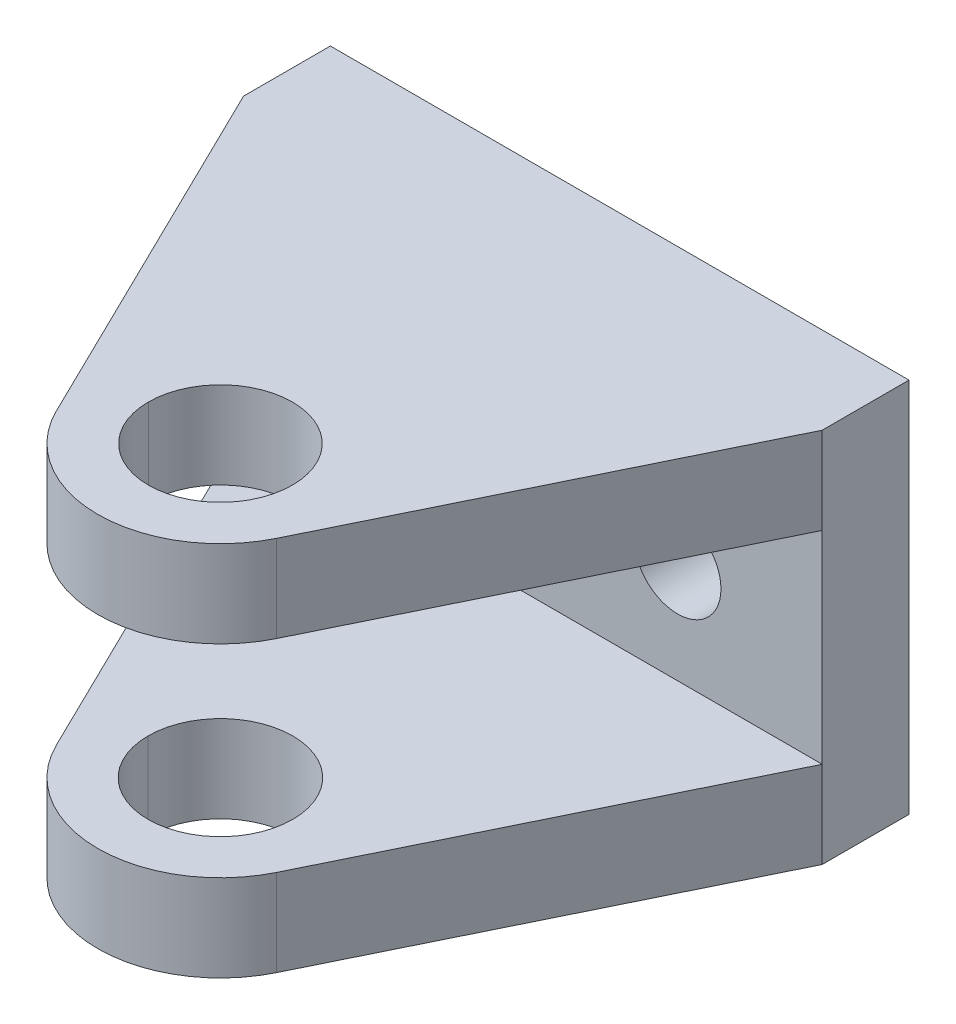
ISO-10303-21;
HEADER;
FILE_DESCRIPTION(('STEP AP214'),'2;1');
FILE_NAME('part.step','',(''),(''),'','','');
FILE_SCHEMA(('AUTOMOTIVE_DESIGN { 1 0 10303 214 1 1 1 1 }'));
ENDSEC;
DATA;
#1=APPLICATION_CONTEXT('core data for automotive mechanical design processes');
#2=APPLICATION_PROTOCOL_DEFINITION('international standard','automotive_design',2000,#1);
#3=PRODUCT_CONTEXT('',#1,'mechanical');
#4=PRODUCT('Part','Part','',(#3));
#5=PRODUCT_RELATED_PRODUCT_CATEGORY('part','',(#4));
#6=PRODUCT_DEFINITION_FORMATION('','',#4);
#7=PRODUCT_DEFINITION_CONTEXT('part definition',#1,'design');
#8=PRODUCT_DEFINITION('design','',#6,#7);
#9=PRODUCT_DEFINITION_SHAPE('','',#8);
#10=(LENGTH_UNIT() NAMED_UNIT(*) SI_UNIT(.MILLI.,.METRE.));
#11=(NAMED_UNIT(*) PLANE_ANGLE_UNIT() SI_UNIT($,.RADIAN.));
#12=(NAMED_UNIT(*) SI_UNIT($,.STERADIAN.) SOLID_ANGLE_UNIT());
#13=UNCERTAINTY_MEASURE_WITH_UNIT(LENGTH_MEASURE(1.E-05),#10,'distance_accuracy_value','');
#14=(GEOMETRIC_REPRESENTATION_CONTEXT(3) GLOBAL_UNCERTAINTY_ASSIGNED_CONTEXT((#13)) GLOBAL_UNIT_ASSIGNED_CONTEXT((#10,
#11,#12)) REPRESENTATION_CONTEXT('',''));
#15=CARTESIAN_POINT('',(0.,0.,0.));
#16=DIRECTION('',(0.,0.,1.));
#17=DIRECTION('',(1.,0.,0.));
#18=AXIS2_PLACEMENT_3D('',#15,#16,#17);
#19=CARTESIAN_POINT('',(5.,3.5,13.8));
#20=DIRECTION('',(0.,1.,0.));
#21=DIRECTION('',(-1.,0.,0.));
#22=AXIS2_PLACEMENT_3D('',#19,#20,#21);
#23=CYLINDRICAL_SURFACE('',#22,2.48870243190225);
#24=CARTESIAN_POINT('',(5.,3.5,13.8));
#25=DIRECTION('',(0.,1.,0.));
#26=DIRECTION('',(-1.,0.,0.));
#27=AXIS2_PLACEMENT_3D('',#24,#25,#26);
#28=CIRCLE('',#27,2.48870243190225);
#29=CARTESIAN_POINT('',(7.48870243190224,3.5,13.8));
#30=VERTEX_POINT('',#29);
#31=CARTESIAN_POINT('',(2.51129756809775,3.5,13.8));
#32=VERTEX_POINT('',#31);
#33=EDGE_CURVE('E41',#30,#32,#28,.T.);
#34=ORIENTED_EDGE('',*,*,#33,.F.);
#35=DIRECTION('',(0.,1.,0.));
#36=VECTOR('',#35,1.);
#37=CARTESIAN_POINT('',(7.48870243190224,3.5,13.8));
#38=LINE('',#37,#36);
#39=CARTESIAN_POINT('',(7.48870243190224,6.5,13.8));
#40=VERTEX_POINT('',#39);
#41=EDGE_CURVE('E11',#30,#40,#38,.T.);
#42=ORIENTED_EDGE('',*,*,#41,.T.);
#43=CARTESIAN_POINT('',(5.,6.5,13.8));
#44=DIRECTION('',(0.,1.,0.));
#45=DIRECTION('',(-1.,0.,0.));
#46=AXIS2_PLACEMENT_3D('',#43,#44,#45);
#47=CIRCLE('',#46,2.48870243190225);
#48=CARTESIAN_POINT('',(2.51129756809775,6.5,13.8));
#49=VERTEX_POINT('',#48);
#50=EDGE_CURVE('E28',#40,#49,#47,.T.);
#51=ORIENTED_EDGE('',*,*,#50,.T.);
#52=DIRECTION('',(0.,1.,0.));
#53=VECTOR('',#52,1.);
#54=CARTESIAN_POINT('',(2.51129756809775,3.5,13.8));
#55=LINE('',#54,#53);
#56=EDGE_CURVE('E170',#32,#49,#55,.T.);
#57=ORIENTED_EDGE('',*,*,#56,.F.);
#58=EDGE_LOOP('',(#34,#42,#51,#57));
#59=FACE_BOUND('',#58,.T.);
#60=ADVANCED_FACE('F17',(#59),#23,.F.);
#61=CARTESIAN_POINT('',(5.,-3.5,13.8));
#62=DIRECTION('',(0.,-1.,0.));
#63=DIRECTION('',(1.,0.,0.));
#64=AXIS2_PLACEMENT_3D('',#61,#62,#63);
#65=CYLINDRICAL_SURFACE('',#64,2.5);
#66=CARTESIAN_POINT('',(5.,-3.5,13.8));
#67=DIRECTION('',(0.,-1.,0.));
#68=DIRECTION('',(1.,0.,0.));
#69=AXIS2_PLACEMENT_3D('',#66,#67,#68);
#70=CIRCLE('',#69,2.5);
#71=CARTESIAN_POINT('',(2.5,-3.5,13.8));
#72=VERTEX_POINT('',#71);
#73=CARTESIAN_POINT('',(7.5,-3.5,13.8));
#74=VERTEX_POINT('',#73);
#75=EDGE_CURVE('E264',#72,#74,#70,.T.);
#76=ORIENTED_EDGE('',*,*,#75,.F.);
#77=DIRECTION('',(0.,-1.,0.));
#78=VECTOR('',#77,1.);
#79=CARTESIAN_POINT('',(2.5,-3.5,13.8));
#80=LINE('',#79,#78);
#81=CARTESIAN_POINT('',(2.5,-6.5,13.8));
#82=VERTEX_POINT('',#81);
#83=EDGE_CURVE('E207',#72,#82,#80,.T.);
#84=ORIENTED_EDGE('',*,*,#83,.T.);
#85=CARTESIAN_POINT('',(5.,-6.5,13.8));
#86=DIRECTION('',(0.,-1.,0.));
#87=DIRECTION('',(1.,0.,0.));
#88=AXIS2_PLACEMENT_3D('',#85,#86,#87);
#89=CIRCLE('',#88,2.5);
#90=CARTESIAN_POINT('',(7.5,-6.5,13.8));
#91=VERTEX_POINT('',#90);
#92=EDGE_CURVE('E21',#82,#91,#89,.T.);
#93=ORIENTED_EDGE('',*,*,#92,.T.);
#94=DIRECTION('',(0.,-1.,0.));
#95=VECTOR('',#94,1.);
#96=CARTESIAN_POINT('',(7.5,-3.5,13.8));
#97=LINE('',#96,#95);
#98=EDGE_CURVE('E217',#74,#91,#97,.T.);
#99=ORIENTED_EDGE('',*,*,#98,.F.);
#100=EDGE_LOOP('',(#76,#84,#93,#99));
#101=FACE_BOUND('',#100,.T.);
#102=ADVANCED_FACE('F448',(#101),#65,.F.);
#103=CARTESIAN_POINT('',(10.,0.,3.));
#104=DIRECTION('',(0.,0.,-1.));
#105=DIRECTION('',(-1.,0.,0.));
#106=AXIS2_PLACEMENT_3D('',#103,#104,#105);
#107=CYLINDRICAL_SURFACE('',#106,1.5);
#108=CARTESIAN_POINT('',(10.,0.,3.));
#109=DIRECTION('',(0.,0.,1.));
#110=DIRECTION('',(1.,0.,0.));
#111=AXIS2_PLACEMENT_3D('',#108,#109,#110);
#112=CIRCLE('',#111,1.5);
#113=CARTESIAN_POINT('',(8.5,0.,3.));
#114=VERTEX_POINT('',#113);
#115=CARTESIAN_POINT('',(11.5,0.,3.));
#116=VERTEX_POINT('',#115);
#117=EDGE_CURVE('E184',#114,#116,#112,.T.);
#118=ORIENTED_EDGE('',*,*,#117,.T.);
#119=DIRECTION('',(0.,0.,-1.));
#120=VECTOR('',#119,1.);
#121=CARTESIAN_POINT('',(11.5,0.,3.));
#122=LINE('',#121,#120);
#123=CARTESIAN_POINT('',(11.5,0.,0.));
#124=VERTEX_POINT('',#123);
#125=EDGE_CURVE('E180',#116,#124,#122,.T.);
#126=ORIENTED_EDGE('',*,*,#125,.T.);
#127=CARTESIAN_POINT('',(10.,0.,0.));
#128=DIRECTION('',(0.,0.,1.));
#129=DIRECTION('',(1.,0.,0.));
#130=AXIS2_PLACEMENT_3D('',#127,#128,#129);
#131=CIRCLE('',#130,1.5);
#132=CARTESIAN_POINT('',(8.5,0.,0.));
#133=VERTEX_POINT('',#132);
#134=EDGE_CURVE('E269',#133,#124,#131,.T.);
#135=ORIENTED_EDGE('',*,*,#134,.F.);
#136=DIRECTION('',(0.,0.,-1.));
#137=VECTOR('',#136,1.);
#138=CARTESIAN_POINT('',(8.5,0.,3.));
#139=LINE('',#138,#137);
#140=EDGE_CURVE('E227',#114,#133,#139,.T.);
#141=ORIENTED_EDGE('',*,*,#140,.F.);
#142=EDGE_LOOP('',(#118,#126,#135,#141));
#143=FACE_BOUND('',#142,.T.);
#144=ADVANCED_FACE('F434',(#143),#107,.F.);
#145=CARTESIAN_POINT('',(0.,0.,3.));
#146=DIRECTION('',(0.,0.,-1.));
#147=DIRECTION('',(-1.,0.,0.));
#148=AXIS2_PLACEMENT_3D('',#145,#146,#147);
#149=CYLINDRICAL_SURFACE('',#148,1.5);
#150=CARTESIAN_POINT('',(0.,0.,3.));
#151=DIRECTION('',(0.,0.,1.));
#152=DIRECTION('',(1.,0.,0.));
#153=AXIS2_PLACEMENT_3D('',#150,#151,#152);
#154=CIRCLE('',#153,1.5);
#155=CARTESIAN_POINT('',(-1.5,0.,3.));
#156=VERTEX_POINT('',#155);
#157=CARTESIAN_POINT('',(1.5,0.,3.));
#158=VERTEX_POINT('',#157);
#159=EDGE_CURVE('E185',#156,#158,#154,.T.);
#160=ORIENTED_EDGE('',*,*,#159,.T.);
#161=DIRECTION('',(0.,0.,-1.));
#162=VECTOR('',#161,1.);
#163=CARTESIAN_POINT('',(1.5,0.,3.));
#164=LINE('',#163,#162);
#165=CARTESIAN_POINT('',(1.5,0.,0.));
#166=VERTEX_POINT('',#165);
#167=EDGE_CURVE('E166',#158,#166,#164,.T.);
#168=ORIENTED_EDGE('',*,*,#167,.T.);
#169=CARTESIAN_POINT('',(0.,0.,0.));
#170=DIRECTION('',(0.,0.,1.));
#171=DIRECTION('',(1.,0.,0.));
#172=AXIS2_PLACEMENT_3D('',#169,#170,#171);
#173=CIRCLE('',#172,1.5);
#174=CARTESIAN_POINT('',(-1.5,0.,0.));
#175=VERTEX_POINT('',#174);
#176=EDGE_CURVE('E199',#175,#166,#173,.T.);
#177=ORIENTED_EDGE('',*,*,#176,.F.);
#178=DIRECTION('',(0.,0.,-1.));
#179=VECTOR('',#178,1.);
#180=CARTESIAN_POINT('',(-1.5,0.,3.));
#181=LINE('',#180,#179);
#182=EDGE_CURVE('E226',#156,#175,#181,.T.);
#183=ORIENTED_EDGE('',*,*,#182,.F.);
#184=EDGE_LOOP('',(#160,#168,#177,#183));
#185=FACE_BOUND('',#184,.T.);
#186=ADVANCED_FACE('F436',(#185),#149,.F.);
#187=CARTESIAN_POINT('',(0.,0.,3.));
#188=DIRECTION('',(0.,0.,1.));
#189=DIRECTION('',(1.,0.,0.));
#190=AXIS2_PLACEMENT_3D('',#187,#188,#189);
#191=PLANE('',#190);
#192=DIRECTION('',(0.,1.,0.));
#193=VECTOR('',#192,1.);
#194=CARTESIAN_POINT('',(15.,-6.5,3.));
#195=LINE('',#194,#193);
#196=CARTESIAN_POINT('',(15.,-3.5,3.));
#197=VERTEX_POINT('',#196);
#198=CARTESIAN_POINT('',(15.,3.5,3.));
#199=VERTEX_POINT('',#198);
#200=EDGE_CURVE('E162',#197,#199,#195,.T.);
#201=ORIENTED_EDGE('',*,*,#200,.T.);
#202=DIRECTION('',(-1.,0.,0.));
#203=VECTOR('',#202,1.);
#204=CARTESIAN_POINT('',(-5.,3.5,3.));
#205=LINE('',#204,#203);
#206=CARTESIAN_POINT('',(-5.,3.5,3.));
#207=VERTEX_POINT('',#206);
#208=EDGE_CURVE('E167',#199,#207,#205,.T.);
#209=ORIENTED_EDGE('',*,*,#208,.T.);
#210=DIRECTION('',(0.,-1.,0.));
#211=VECTOR('',#210,1.);
#212=CARTESIAN_POINT('',(-5.,6.5,3.));
#213=LINE('',#212,#211);
#214=CARTESIAN_POINT('',(-5.,-3.5,3.));
#215=VERTEX_POINT('',#214);
#216=EDGE_CURVE('E198',#207,#215,#213,.T.);
#217=ORIENTED_EDGE('',*,*,#216,.T.);
#218=DIRECTION('',(1.,0.,0.));
#219=VECTOR('',#218,1.);
#220=CARTESIAN_POINT('',(5.,-3.5,3.));
#221=LINE('',#220,#219);
#222=EDGE_CURVE('E195',#215,#197,#221,.T.);
#223=ORIENTED_EDGE('',*,*,#222,.T.);
#224=EDGE_LOOP('',(#201,#209,#217,#223));
#225=FACE_BOUND('',#224,.T.);
#226=ORIENTED_EDGE('',*,*,#159,.F.);
#227=CARTESIAN_POINT('',(0.,0.,3.));
#228=DIRECTION('',(0.,0.,1.));
#229=DIRECTION('',(1.,0.,0.));
#230=AXIS2_PLACEMENT_3D('',#227,#228,#229);
#231=CIRCLE('',#230,1.5);
#232=EDGE_CURVE('E191',#158,#156,#231,.T.);
#233=ORIENTED_EDGE('',*,*,#232,.F.);
#234=EDGE_LOOP('',(#226,#233));
#235=FACE_BOUND('',#234,.T.);
#236=ORIENTED_EDGE('',*,*,#117,.F.);
#237=CARTESIAN_POINT('',(10.,0.,3.));
#238=DIRECTION('',(0.,0.,1.));
#239=DIRECTION('',(1.,0.,0.));
#240=AXIS2_PLACEMENT_3D('',#237,#238,#239);
#241=CIRCLE('',#240,1.5);
#242=EDGE_CURVE('E222',#116,#114,#241,.T.);
#243=ORIENTED_EDGE('',*,*,#242,.F.);
#244=EDGE_LOOP('',(#236,#243));
#245=FACE_BOUND('',#244,.T.);
#246=ADVANCED_FACE('F349',(#225,#235,#245),#191,.T.);
#247=CARTESIAN_POINT('',(0.,0.,0.));
#248=DIRECTION('',(0.,0.,1.));
#249=DIRECTION('',(1.,0.,0.));
#250=AXIS2_PLACEMENT_3D('',#247,#248,#249);
#251=PLANE('',#250);
#252=DIRECTION('',(-1.,0.,0.));
#253=VECTOR('',#252,1.);
#254=CARTESIAN_POINT('',(15.,6.5,0.));
#255=LINE('',#254,#253);
#256=CARTESIAN_POINT('',(15.,6.5,0.));
#257=VERTEX_POINT('',#256);
#258=CARTESIAN_POINT('',(-5.,6.5,0.));
#259=VERTEX_POINT('',#258);
#260=EDGE_CURVE('E203',#257,#259,#255,.T.);
#261=ORIENTED_EDGE('',*,*,#260,.F.);
#262=DIRECTION('',(0.,1.,0.));
#263=VECTOR('',#262,1.);
#264=CARTESIAN_POINT('',(15.,-6.5,0.));
#265=LINE('',#264,#263);
#266=CARTESIAN_POINT('',(15.,-6.5,0.));
#267=VERTEX_POINT('',#266);
#268=EDGE_CURVE('E190',#267,#257,#265,.T.);
#269=ORIENTED_EDGE('',*,*,#268,.F.);
#270=DIRECTION('',(1.,0.,0.));
#271=VECTOR('',#270,1.);
#272=CARTESIAN_POINT('',(15.,-6.5,0.));
#273=LINE('',#272,#271);
#274=CARTESIAN_POINT('',(-5.,-6.5,0.));
#275=VERTEX_POINT('',#274);
#276=EDGE_CURVE('E160',#275,#267,#273,.T.);
#277=ORIENTED_EDGE('',*,*,#276,.F.);
#278=DIRECTION('',(0.,-1.,0.));
#279=VECTOR('',#278,1.);
#280=CARTESIAN_POINT('',(-5.,6.5,0.));
#281=LINE('',#280,#279);
#282=EDGE_CURVE('E175',#259,#275,#281,.T.);
#283=ORIENTED_EDGE('',*,*,#282,.F.);
#284=EDGE_LOOP('',(#261,#269,#277,#283));
#285=FACE_BOUND('',#284,.T.);
#286=ORIENTED_EDGE('',*,*,#176,.T.);
#287=CARTESIAN_POINT('',(0.,0.,0.));
#288=DIRECTION('',(0.,0.,1.));
#289=DIRECTION('',(1.,0.,0.));
#290=AXIS2_PLACEMENT_3D('',#287,#288,#289);
#291=CIRCLE('',#290,1.5);
#292=EDGE_CURVE('E221',#166,#175,#291,.T.);
#293=ORIENTED_EDGE('',*,*,#292,.T.);
#294=EDGE_LOOP('',(#286,#293));
#295=FACE_BOUND('',#294,.T.);
#296=ORIENTED_EDGE('',*,*,#134,.T.);
#297=CARTESIAN_POINT('',(10.,0.,0.));
#298=DIRECTION('',(0.,0.,1.));
#299=DIRECTION('',(1.,0.,0.));
#300=AXIS2_PLACEMENT_3D('',#297,#298,#299);
#301=CIRCLE('',#300,1.5);
#302=EDGE_CURVE('E271',#124,#133,#301,.T.);
#303=ORIENTED_EDGE('',*,*,#302,.T.);
#304=EDGE_LOOP('',(#296,#303));
#305=FACE_BOUND('',#304,.T.);
#306=ADVANCED_FACE('F399',(#285,#295,#305),#251,.F.);
#307=CARTESIAN_POINT('',(15.,6.5,3.));
#308=DIRECTION('',(0.,-1.,0.));
#309=DIRECTION('',(0.,0.,-1.));
#310=AXIS2_PLACEMENT_3D('',#307,#308,#309);
#311=PLANE('',#310);
#312=ORIENTED_EDGE('',*,*,#260,.T.);
#313=DIRECTION('',(0.,0.,-1.));
#314=VECTOR('',#313,1.);
#315=CARTESIAN_POINT('',(-5.,6.5,3.));
#316=LINE('',#315,#314);
#317=CARTESIAN_POINT('',(-5.,6.5,3.));
#318=VERTEX_POINT('',#317);
#319=EDGE_CURVE('E179',#318,#259,#316,.T.);
#320=ORIENTED_EDGE('',*,*,#319,.F.);
#321=DIRECTION('',(0.439227786881589,0.,0.898375729431234));
#322=VECTOR('',#321,1.);
#323=CARTESIAN_POINT('',(-5.,6.5,3.));
#324=LINE('',#323,#322);
#325=CARTESIAN_POINT('',(1.19079958869209,6.5,15.6623685075581));
#326=VERTEX_POINT('',#325);
#327=EDGE_CURVE('E135',#318,#326,#324,.T.);
#328=ORIENTED_EDGE('',*,*,#327,.T.);
#329=CARTESIAN_POINT('',(5.,6.5,13.8));
#330=DIRECTION('',(0.,1.,0.));
#331=DIRECTION('',(-1.,0.,0.));
#332=AXIS2_PLACEMENT_3D('',#329,#330,#331);
#333=CIRCLE('',#332,4.24009719599117);
#334=CARTESIAN_POINT('',(8.8092004113079,6.5,15.6623685075581));
#335=VERTEX_POINT('',#334);
#336=EDGE_CURVE('E127',#326,#335,#333,.T.);
#337=ORIENTED_EDGE('',*,*,#336,.T.);
#338=DIRECTION('',(0.439227786881589,0.,-0.898375729431234));
#339=VECTOR('',#338,1.);
#340=CARTESIAN_POINT('',(15.,6.5,3.));
#341=LINE('',#340,#339);
#342=CARTESIAN_POINT('',(15.,6.5,3.));
#343=VERTEX_POINT('',#342);
#344=EDGE_CURVE('E116',#335,#343,#341,.T.);
#345=ORIENTED_EDGE('',*,*,#344,.T.);
#346=DIRECTION('',(0.,0.,-1.));
#347=VECTOR('',#346,1.);
#348=CARTESIAN_POINT('',(15.,6.5,3.));
#349=LINE('',#348,#347);
#350=EDGE_CURVE('E128',#343,#257,#349,.T.);
#351=ORIENTED_EDGE('',*,*,#350,.T.);
#352=EDGE_LOOP('',(#312,#320,#328,#337,#345,#351));
#353=FACE_BOUND('',#352,.T.);
#354=CARTESIAN_POINT('',(5.,6.5,13.8));
#355=DIRECTION('',(0.,1.,0.));
#356=DIRECTION('',(-1.,0.,0.));
#357=AXIS2_PLACEMENT_3D('',#354,#355,#356);
#358=CIRCLE('',#357,2.48870243190225);
#359=EDGE_CURVE('E239',#49,#40,#358,.T.);
#360=ORIENTED_EDGE('',*,*,#359,.F.);
#361=ORIENTED_EDGE('',*,*,#50,.F.);
#362=EDGE_LOOP('',(#360,#361));
#363=FACE_BOUND('',#362,.T.);
#364=ADVANCED_FACE('F132',(#353,#363),#311,.F.);
#365=CARTESIAN_POINT('',(-5.,6.5,3.));
#366=DIRECTION('',(1.,0.,0.));
#367=DIRECTION('',(0.,1.,0.));
#368=AXIS2_PLACEMENT_3D('',#365,#366,#367);
#369=PLANE('',#368);
#370=ORIENTED_EDGE('',*,*,#282,.T.);
#371=DIRECTION('',(0.,0.,-1.));
#372=VECTOR('',#371,1.);
#373=CARTESIAN_POINT('',(-5.,-6.5,3.));
#374=LINE('',#373,#372);
#375=CARTESIAN_POINT('',(-5.,-6.5,3.));
#376=VERTEX_POINT('',#375);
#377=EDGE_CURVE('E263',#376,#275,#374,.T.);
#378=ORIENTED_EDGE('',*,*,#377,.F.);
#379=DIRECTION('',(0.,-1.,0.));
#380=VECTOR('',#379,1.);
#381=CARTESIAN_POINT('',(-5.,-3.5,3.));
#382=LINE('',#381,#380);
#383=EDGE_CURVE('E246',#215,#376,#382,.T.);
#384=ORIENTED_EDGE('',*,*,#383,.F.);
#385=ORIENTED_EDGE('',*,*,#216,.F.);
#386=DIRECTION('',(0.,-1.,0.));
#387=VECTOR('',#386,1.);
#388=CARTESIAN_POINT('',(-5.,6.5,3.));
#389=LINE('',#388,#387);
#390=EDGE_CURVE('E208',#318,#207,#389,.T.);
#391=ORIENTED_EDGE('',*,*,#390,.F.);
#392=ORIENTED_EDGE('',*,*,#319,.T.);
#393=EDGE_LOOP('',(#370,#378,#384,#385,#391,#392));
#394=FACE_BOUND('',#393,.T.);
#395=ADVANCED_FACE('F404',(#394),#369,.F.);
#396=CARTESIAN_POINT('',(15.,-6.5,3.));
#397=DIRECTION('',(0.,1.,0.));
#398=DIRECTION('',(1.,0.,0.));
#399=AXIS2_PLACEMENT_3D('',#396,#397,#398);
#400=PLANE('',#399);
#401=ORIENTED_EDGE('',*,*,#276,.T.);
#402=DIRECTION('',(0.,0.,-1.));
#403=VECTOR('',#402,1.);
#404=CARTESIAN_POINT('',(15.,-6.5,3.));
#405=LINE('',#404,#403);
#406=CARTESIAN_POINT('',(15.,-6.5,3.));
#407=VERTEX_POINT('',#406);
#408=EDGE_CURVE('E186',#407,#267,#405,.T.);
#409=ORIENTED_EDGE('',*,*,#408,.F.);
#410=DIRECTION('',(-0.43922778688159,0.,0.898375729431234));
#411=VECTOR('',#410,1.);
#412=CARTESIAN_POINT('',(15.,-6.5,3.));
#413=LINE('',#412,#411);
#414=CARTESIAN_POINT('',(8.8092004113079,-6.5,15.6623685075581));
#415=VERTEX_POINT('',#414);
#416=EDGE_CURVE('E157',#407,#415,#413,.T.);
#417=ORIENTED_EDGE('',*,*,#416,.T.);
#418=CARTESIAN_POINT('',(5.,-6.5,13.8));
#419=DIRECTION('',(0.,-1.,0.));
#420=DIRECTION('',(1.,0.,0.));
#421=AXIS2_PLACEMENT_3D('',#418,#419,#420);
#422=CIRCLE('',#421,4.24009719599117);
#423=CARTESIAN_POINT('',(1.19079958869209,-6.5,15.6623685075581));
#424=VERTEX_POINT('',#423);
#425=EDGE_CURVE('E161',#415,#424,#422,.T.);
#426=ORIENTED_EDGE('',*,*,#425,.T.);
#427=DIRECTION('',(-0.439227786881589,0.,-0.898375729431234));
#428=VECTOR('',#427,1.);
#429=CARTESIAN_POINT('',(-5.,-6.5,3.));
#430=LINE('',#429,#428);
#431=EDGE_CURVE('E252',#424,#376,#430,.T.);
#432=ORIENTED_EDGE('',*,*,#431,.T.);
#433=ORIENTED_EDGE('',*,*,#377,.T.);
#434=EDGE_LOOP('',(#401,#409,#417,#426,#432,#433));
#435=FACE_BOUND('',#434,.T.);
#436=CARTESIAN_POINT('',(5.,-6.5,13.8));
#437=DIRECTION('',(0.,-1.,0.));
#438=DIRECTION('',(1.,0.,0.));
#439=AXIS2_PLACEMENT_3D('',#436,#437,#438);
#440=CIRCLE('',#439,2.5);
#441=EDGE_CURVE('E212',#91,#82,#440,.T.);
#442=ORIENTED_EDGE('',*,*,#441,.F.);
#443=ORIENTED_EDGE('',*,*,#92,.F.);
#444=EDGE_LOOP('',(#442,#443));
#445=FACE_BOUND('',#444,.T.);
#446=ADVANCED_FACE('F459',(#435,#445),#400,.F.);
#447=CARTESIAN_POINT('',(15.,-6.5,3.));
#448=DIRECTION('',(-1.,0.,0.));
#449=DIRECTION('',(0.,0.,1.));
#450=AXIS2_PLACEMENT_3D('',#447,#448,#449);
#451=PLANE('',#450);
#452=ORIENTED_EDGE('',*,*,#268,.T.);
#453=ORIENTED_EDGE('',*,*,#350,.F.);
#454=DIRECTION('',(0.,1.,0.));
#455=VECTOR('',#454,1.);
#456=CARTESIAN_POINT('',(15.,3.5,3.));
#457=LINE('',#456,#455);
#458=EDGE_CURVE('E123',#199,#343,#457,.T.);
#459=ORIENTED_EDGE('',*,*,#458,.F.);
#460=ORIENTED_EDGE('',*,*,#200,.F.);
#461=DIRECTION('',(0.,1.,0.));
#462=VECTOR('',#461,1.);
#463=CARTESIAN_POINT('',(15.,-6.5,3.));
#464=LINE('',#463,#462);
#465=EDGE_CURVE('E236',#407,#197,#464,.T.);
#466=ORIENTED_EDGE('',*,*,#465,.F.);
#467=ORIENTED_EDGE('',*,*,#408,.T.);
#468=EDGE_LOOP('',(#452,#453,#459,#460,#466,#467));
#469=FACE_BOUND('',#468,.T.);
#470=ADVANCED_FACE('F394',(#469),#451,.F.);
#471=CARTESIAN_POINT('',(0.,0.,3.));
#472=DIRECTION('',(0.,0.,-1.));
#473=DIRECTION('',(-1.,0.,0.));
#474=AXIS2_PLACEMENT_3D('',#471,#472,#473);
#475=CYLINDRICAL_SURFACE('',#474,1.5);
#476=ORIENTED_EDGE('',*,*,#167,.F.);
#477=ORIENTED_EDGE('',*,*,#232,.T.);
#478=ORIENTED_EDGE('',*,*,#182,.T.);
#479=ORIENTED_EDGE('',*,*,#292,.F.);
#480=EDGE_LOOP('',(#476,#477,#478,#479));
#481=FACE_BOUND('',#480,.T.);
#482=ADVANCED_FACE('F340',(#481),#475,.F.);
#483=CARTESIAN_POINT('',(10.,0.,3.));
#484=DIRECTION('',(0.,0.,-1.));
#485=DIRECTION('',(-1.,0.,0.));
#486=AXIS2_PLACEMENT_3D('',#483,#484,#485);
#487=CYLINDRICAL_SURFACE('',#486,1.5);
#488=ORIENTED_EDGE('',*,*,#125,.F.);
#489=ORIENTED_EDGE('',*,*,#242,.T.);
#490=ORIENTED_EDGE('',*,*,#140,.T.);
#491=ORIENTED_EDGE('',*,*,#302,.F.);
#492=EDGE_LOOP('',(#488,#489,#490,#491));
#493=FACE_BOUND('',#492,.T.);
#494=ADVANCED_FACE('F429',(#493),#487,.F.);
#495=CARTESIAN_POINT('',(-5.,-3.5,3.));
#496=DIRECTION('',(-0.898375729431234,0.,0.439227786881589));
#497=DIRECTION('',(0.,1.,0.));
#498=AXIS2_PLACEMENT_3D('',#495,#496,#497);
#499=PLANE('',#498);
#500=ORIENTED_EDGE('',*,*,#431,.F.);
#501=DIRECTION('',(0.,-1.,0.));
#502=VECTOR('',#501,1.);
#503=CARTESIAN_POINT('',(1.19079958869209,-3.5,15.6623685075581));
#504=LINE('',#503,#502);
#505=CARTESIAN_POINT('',(1.19079958869209,-3.5,15.6623685075581));
#506=VERTEX_POINT('',#505);
#507=EDGE_CURVE('E231',#506,#424,#504,.T.);
#508=ORIENTED_EDGE('',*,*,#507,.F.);
#509=DIRECTION('',(-0.439227786881589,0.,-0.898375729431234));
#510=VECTOR('',#509,1.);
#511=CARTESIAN_POINT('',(-5.,-3.5,3.));
#512=LINE('',#511,#510);
#513=EDGE_CURVE('E253',#506,#215,#512,.T.);
#514=ORIENTED_EDGE('',*,*,#513,.T.);
#515=ORIENTED_EDGE('',*,*,#383,.T.);
#516=EDGE_LOOP('',(#500,#508,#514,#515));
#517=FACE_BOUND('',#516,.T.);
#518=ADVANCED_FACE('F465',(#517),#499,.T.);
#519=CARTESIAN_POINT('',(5.,-3.5,13.8));
#520=DIRECTION('',(0.,-1.,0.));
#521=DIRECTION('',(1.,0.,0.));
#522=AXIS2_PLACEMENT_3D('',#519,#520,#521);
#523=CYLINDRICAL_SURFACE('',#522,4.24009719599117);
#524=ORIENTED_EDGE('',*,*,#425,.F.);
#525=DIRECTION('',(0.,-1.,0.));
#526=VECTOR('',#525,1.);
#527=CARTESIAN_POINT('',(8.8092004113079,-3.5,15.6623685075581));
#528=LINE('',#527,#526);
#529=CARTESIAN_POINT('',(8.8092004113079,-3.5,15.6623685075581));
#530=VERTEX_POINT('',#529);
#531=EDGE_CURVE('E283',#530,#415,#528,.T.);
#532=ORIENTED_EDGE('',*,*,#531,.F.);
#533=CARTESIAN_POINT('',(5.,-3.5,13.8));
#534=DIRECTION('',(0.,-1.,0.));
#535=DIRECTION('',(1.,0.,0.));
#536=AXIS2_PLACEMENT_3D('',#533,#534,#535);
#537=CIRCLE('',#536,4.24009719599117);
#538=EDGE_CURVE('E235',#530,#506,#537,.T.);
#539=ORIENTED_EDGE('',*,*,#538,.T.);
#540=ORIENTED_EDGE('',*,*,#507,.T.);
#541=EDGE_LOOP('',(#524,#532,#539,#540));
#542=FACE_BOUND('',#541,.T.);
#543=ADVANCED_FACE('F468',(#542),#523,.T.);
#544=CARTESIAN_POINT('',(15.,-3.5,3.));
#545=DIRECTION('',(0.898375729431234,0.,0.43922778688159));
#546=DIRECTION('',(0.,-1.,0.));
#547=AXIS2_PLACEMENT_3D('',#544,#545,#546);
#548=PLANE('',#547);
#549=ORIENTED_EDGE('',*,*,#416,.F.);
#550=ORIENTED_EDGE('',*,*,#465,.T.);
#551=DIRECTION('',(-0.43922778688159,0.,0.898375729431234));
#552=VECTOR('',#551,1.);
#553=CARTESIAN_POINT('',(15.,-3.5,3.));
#554=LINE('',#553,#552);
#555=EDGE_CURVE('E242',#197,#530,#554,.T.);
#556=ORIENTED_EDGE('',*,*,#555,.T.);
#557=ORIENTED_EDGE('',*,*,#531,.T.);
#558=EDGE_LOOP('',(#549,#550,#556,#557));
#559=FACE_BOUND('',#558,.T.);
#560=ADVANCED_FACE('F472',(#559),#548,.T.);
#561=CARTESIAN_POINT('',(5.,-3.5,13.8));
#562=DIRECTION('',(0.,-1.,0.));
#563=DIRECTION('',(-1.,0.,0.));
#564=AXIS2_PLACEMENT_3D('',#561,#562,#563);
#565=PLANE('',#564);
#566=ORIENTED_EDGE('',*,*,#222,.F.);
#567=ORIENTED_EDGE('',*,*,#513,.F.);
#568=ORIENTED_EDGE('',*,*,#538,.F.);
#569=ORIENTED_EDGE('',*,*,#555,.F.);
#570=EDGE_LOOP('',(#566,#567,#568,#569));
#571=FACE_BOUND('',#570,.T.);
#572=CARTESIAN_POINT('',(5.,-3.5,13.8));
#573=DIRECTION('',(0.,-1.,0.));
#574=DIRECTION('',(1.,0.,0.));
#575=AXIS2_PLACEMENT_3D('',#572,#573,#574);
#576=CIRCLE('',#575,2.5);
#577=EDGE_CURVE('E268',#74,#72,#576,.T.);
#578=ORIENTED_EDGE('',*,*,#577,.T.);
#579=ORIENTED_EDGE('',*,*,#75,.T.);
#580=EDGE_LOOP('',(#578,#579));
#581=FACE_BOUND('',#580,.T.);
#582=ADVANCED_FACE('F476',(#571,#581),#565,.F.);
#583=CARTESIAN_POINT('',(5.,-3.5,13.8));
#584=DIRECTION('',(0.,-1.,0.));
#585=DIRECTION('',(1.,0.,0.));
#586=AXIS2_PLACEMENT_3D('',#583,#584,#585);
#587=CYLINDRICAL_SURFACE('',#586,2.5);
#588=ORIENTED_EDGE('',*,*,#83,.F.);
#589=ORIENTED_EDGE('',*,*,#577,.F.);
#590=ORIENTED_EDGE('',*,*,#98,.T.);
#591=ORIENTED_EDGE('',*,*,#441,.T.);
#592=EDGE_LOOP('',(#588,#589,#590,#591));
#593=FACE_BOUND('',#592,.T.);
#594=ADVANCED_FACE('F19',(#593),#587,.F.);
#595=CARTESIAN_POINT('',(-5.,3.5,3.));
#596=DIRECTION('',(-0.898375729431234,0.,0.439227786881589));
#597=DIRECTION('',(0.,1.,0.));
#598=AXIS2_PLACEMENT_3D('',#595,#596,#597);
#599=PLANE('',#598);
#600=ORIENTED_EDGE('',*,*,#327,.F.);
#601=ORIENTED_EDGE('',*,*,#390,.T.);
#602=DIRECTION('',(0.439227786881589,0.,0.898375729431234));
#603=VECTOR('',#602,1.);
#604=CARTESIAN_POINT('',(-5.,3.5,3.));
#605=LINE('',#604,#603);
#606=CARTESIAN_POINT('',(1.19079958869209,3.5,15.6623685075581));
#607=VERTEX_POINT('',#606);
#608=EDGE_CURVE('E213',#207,#607,#605,.T.);
#609=ORIENTED_EDGE('',*,*,#608,.T.);
#610=DIRECTION('',(0.,1.,0.));
#611=VECTOR('',#610,1.);
#612=CARTESIAN_POINT('',(1.19079958869209,3.5,15.6623685075581));
#613=LINE('',#612,#611);
#614=EDGE_CURVE('E174',#607,#326,#613,.T.);
#615=ORIENTED_EDGE('',*,*,#614,.T.);
#616=EDGE_LOOP('',(#600,#601,#609,#615));
#617=FACE_BOUND('',#616,.T.);
#618=ADVANCED_FACE('F408',(#617),#599,.T.);
#619=CARTESIAN_POINT('',(15.,3.5,3.));
#620=DIRECTION('',(0.898375729431234,0.,0.439227786881589));
#621=DIRECTION('',(0.,-1.,0.));
#622=AXIS2_PLACEMENT_3D('',#619,#620,#621);
#623=PLANE('',#622);
#624=ORIENTED_EDGE('',*,*,#344,.F.);
#625=DIRECTION('',(0.,1.,0.));
#626=VECTOR('',#625,1.);
#627=CARTESIAN_POINT('',(8.8092004113079,3.5,15.6623685075581));
#628=LINE('',#627,#626);
#629=CARTESIAN_POINT('',(8.8092004113079,3.5,15.6623685075581));
#630=VERTEX_POINT('',#629);
#631=EDGE_CURVE('E121',#630,#335,#628,.T.);
#632=ORIENTED_EDGE('',*,*,#631,.F.);
#633=DIRECTION('',(0.439227786881589,0.,-0.898375729431234));
#634=VECTOR('',#633,1.);
#635=CARTESIAN_POINT('',(15.,3.5,3.));
#636=LINE('',#635,#634);
#637=EDGE_CURVE('E171',#630,#199,#636,.T.);
#638=ORIENTED_EDGE('',*,*,#637,.T.);
#639=ORIENTED_EDGE('',*,*,#458,.T.);
#640=EDGE_LOOP('',(#624,#632,#638,#639));
#641=FACE_BOUND('',#640,.T.);
#642=ADVANCED_FACE('F118',(#641),#623,.T.);
#643=CARTESIAN_POINT('',(5.,3.5,13.8));
#644=DIRECTION('',(0.,1.,0.));
#645=DIRECTION('',(-1.,0.,0.));
#646=AXIS2_PLACEMENT_3D('',#643,#644,#645);
#647=CYLINDRICAL_SURFACE('',#646,4.24009719599117);
#648=ORIENTED_EDGE('',*,*,#336,.F.);
#649=ORIENTED_EDGE('',*,*,#614,.F.);
#650=CARTESIAN_POINT('',(5.,3.5,13.8));
#651=DIRECTION('',(0.,1.,0.));
#652=DIRECTION('',(-1.,0.,0.));
#653=AXIS2_PLACEMENT_3D('',#650,#651,#652);
#654=CIRCLE('',#653,4.24009719599117);
#655=EDGE_CURVE('E144',#607,#630,#654,.T.);
#656=ORIENTED_EDGE('',*,*,#655,.T.);
#657=ORIENTED_EDGE('',*,*,#631,.T.);
#658=EDGE_LOOP('',(#648,#649,#656,#657));
#659=FACE_BOUND('',#658,.T.);
#660=ADVANCED_FACE('F142',(#659),#647,.T.);
#661=CARTESIAN_POINT('',(5.,3.5,13.8));
#662=DIRECTION('',(0.,1.,0.));
#663=DIRECTION('',(1.,0.,0.));
#664=AXIS2_PLACEMENT_3D('',#661,#662,#663);
#665=PLANE('',#664);
#666=ORIENTED_EDGE('',*,*,#608,.F.);
#667=ORIENTED_EDGE('',*,*,#208,.F.);
#668=ORIENTED_EDGE('',*,*,#637,.F.);
#669=ORIENTED_EDGE('',*,*,#655,.F.);
#670=EDGE_LOOP('',(#666,#667,#668,#669));
#671=FACE_BOUND('',#670,.T.);
#672=CARTESIAN_POINT('',(5.,3.5,13.8));
#673=DIRECTION('',(0.,1.,0.));
#674=DIRECTION('',(-1.,0.,0.));
#675=AXIS2_PLACEMENT_3D('',#672,#673,#674);
#676=CIRCLE('',#675,2.48870243190225);
#677=EDGE_CURVE('E146',#32,#30,#676,.T.);
#678=ORIENTED_EDGE('',*,*,#677,.T.);
#679=ORIENTED_EDGE('',*,*,#33,.T.);
#680=EDGE_LOOP('',(#678,#679));
#681=FACE_BOUND('',#680,.T.);
#682=ADVANCED_FACE('F482',(#671,#681),#665,.F.);
#683=CARTESIAN_POINT('',(5.,3.5,13.8));
#684=DIRECTION('',(0.,1.,0.));
#685=DIRECTION('',(-1.,0.,0.));
#686=AXIS2_PLACEMENT_3D('',#683,#684,#685);
#687=CYLINDRICAL_SURFACE('',#686,2.48870243190225);
#688=ORIENTED_EDGE('',*,*,#41,.F.);
#689=ORIENTED_EDGE('',*,*,#677,.F.);
#690=ORIENTED_EDGE('',*,*,#56,.T.);
#691=ORIENTED_EDGE('',*,*,#359,.T.);
#692=EDGE_LOOP('',(#688,#689,#690,#691));
#693=FACE_BOUND('',#692,.T.);
#694=ADVANCED_FACE('F485',(#693),#687,.F.);
#695=CLOSED_SHELL('',(#60,#102,#144,#186,#246,#306,#364,#395,#446,#470,#482,#494,#518,#543,#560,
#582,#594,#618,#642,#660,#682,#694));
#696=MANIFOLD_SOLID_BREP('B1',#695);
#697=ADVANCED_BREP_SHAPE_REPRESENTATION('',(#18,#696),#14);
#698=SHAPE_DEFINITION_REPRESENTATION(#9,#697);
ENDSEC;
END-ISO-10303-21;
